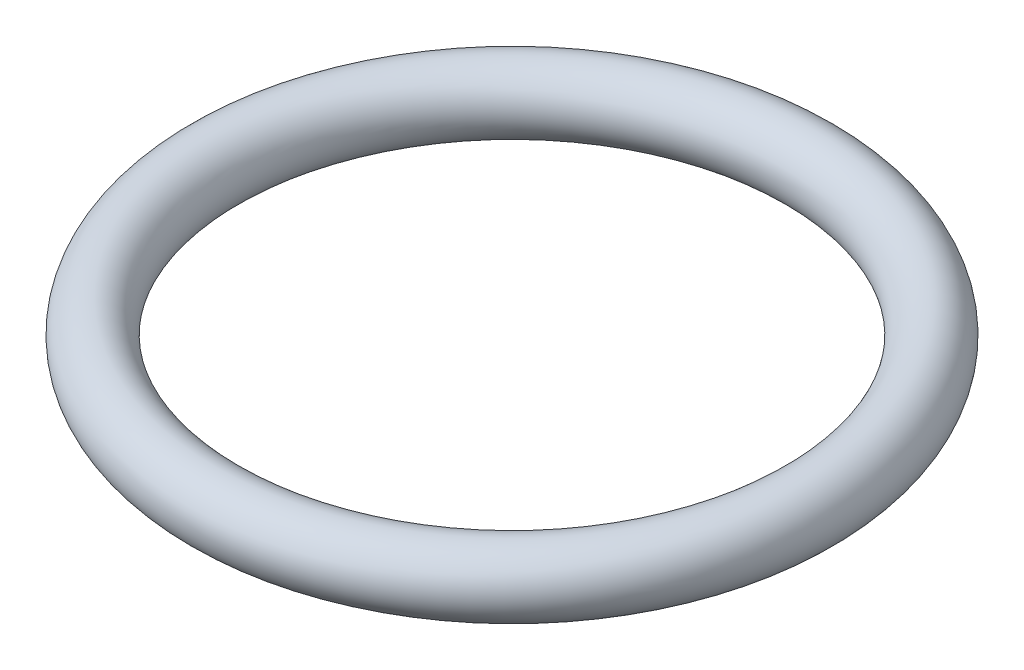
ISO-10303-21;
HEADER;
FILE_DESCRIPTION(('STEP AP214'),'2;1');
FILE_NAME('part.step','',(''),(''),'','','');
FILE_SCHEMA(('AUTOMOTIVE_DESIGN { 1 0 10303 214 1 1 1 1 }'));
ENDSEC;
DATA;
#1=APPLICATION_CONTEXT('core data for automotive mechanical design processes');
#2=APPLICATION_PROTOCOL_DEFINITION('international standard','automotive_design',2000,#1);
#3=PRODUCT_CONTEXT('',#1,'mechanical');
#4=PRODUCT('Part','Part','',(#3));
#5=PRODUCT_RELATED_PRODUCT_CATEGORY('part','',(#4));
#6=PRODUCT_DEFINITION_FORMATION('','',#4);
#7=PRODUCT_DEFINITION_CONTEXT('part definition',#1,'design');
#8=PRODUCT_DEFINITION('design','',#6,#7);
#9=PRODUCT_DEFINITION_SHAPE('','',#8);
#10=(LENGTH_UNIT() NAMED_UNIT(*) SI_UNIT(.MILLI.,.METRE.));
#11=(NAMED_UNIT(*) PLANE_ANGLE_UNIT() SI_UNIT($,.RADIAN.));
#12=(NAMED_UNIT(*) SI_UNIT($,.STERADIAN.) SOLID_ANGLE_UNIT());
#13=UNCERTAINTY_MEASURE_WITH_UNIT(LENGTH_MEASURE(1.E-05),#10,'distance_accuracy_value','');
#14=(GEOMETRIC_REPRESENTATION_CONTEXT(3) GLOBAL_UNCERTAINTY_ASSIGNED_CONTEXT((#13)) GLOBAL_UNIT_ASSIGNED_CONTEXT((#10,
#11,#12)) REPRESENTATION_CONTEXT('',''));
#15=CARTESIAN_POINT('',(0.,0.,0.));
#16=DIRECTION('',(0.,0.,1.));
#17=DIRECTION('',(1.,0.,0.));
#18=AXIS2_PLACEMENT_3D('',#15,#16,#17);
#19=CARTESIAN_POINT('',(0.,0.,0.));
#20=DIRECTION('',(0.,-1.,0.));
#21=DIRECTION('',(0.,0.,-1.));
#22=AXIS2_PLACEMENT_3D('',#19,#20,#21);
#23=TOROIDAL_SURFACE('',#22,22.5,2.5);
#24=CARTESIAN_POINT('',(0.,0.,-25.));
#25=VERTEX_POINT('',#24);
#26=VERTEX_LOOP('',#25);
#27=FACE_BOUND('',#26,.T.);
#28=ADVANCED_FACE('F28',(#27),#23,.T.);
#29=CLOSED_SHELL('',(#28));
#30=MANIFOLD_SOLID_BREP('B2',#29);
#31=ADVANCED_BREP_SHAPE_REPRESENTATION('',(#18,#30),#14);
#32=SHAPE_DEFINITION_REPRESENTATION(#9,#31);
ENDSEC;
END-ISO-10303-21;
